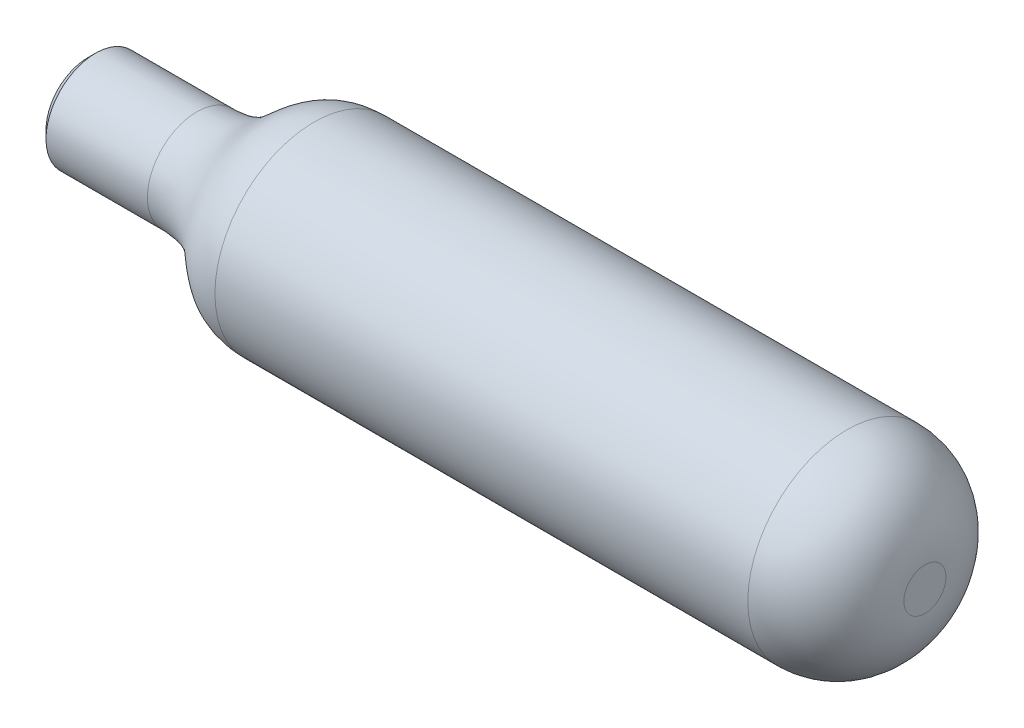
ISO-10303-21;
HEADER;
FILE_DESCRIPTION(('STEP AP214'),'2;1');
FILE_NAME('part.step','',(''),(''),'','','');
FILE_SCHEMA(('AUTOMOTIVE_DESIGN { 1 0 10303 214 1 1 1 1 }'));
ENDSEC;
DATA;
#1=APPLICATION_CONTEXT('core data for automotive mechanical design processes');
#2=APPLICATION_PROTOCOL_DEFINITION('international standard','automotive_design',2000,#1);
#3=PRODUCT_CONTEXT('',#1,'mechanical');
#4=PRODUCT('Part','Part','',(#3));
#5=PRODUCT_RELATED_PRODUCT_CATEGORY('part','',(#4));
#6=PRODUCT_DEFINITION_FORMATION('','',#4);
#7=PRODUCT_DEFINITION_CONTEXT('part definition',#1,'design');
#8=PRODUCT_DEFINITION('design','',#6,#7);
#9=PRODUCT_DEFINITION_SHAPE('','',#8);
#10=(LENGTH_UNIT() NAMED_UNIT(*) SI_UNIT(.MILLI.,.METRE.));
#11=(NAMED_UNIT(*) PLANE_ANGLE_UNIT() SI_UNIT($,.RADIAN.));
#12=(NAMED_UNIT(*) SI_UNIT($,.STERADIAN.) SOLID_ANGLE_UNIT());
#13=UNCERTAINTY_MEASURE_WITH_UNIT(LENGTH_MEASURE(1.E-05),#10,'distance_accuracy_value','');
#14=(GEOMETRIC_REPRESENTATION_CONTEXT(3) GLOBAL_UNCERTAINTY_ASSIGNED_CONTEXT((#13)) GLOBAL_UNIT_ASSIGNED_CONTEXT((#10,
#11,#12)) REPRESENTATION_CONTEXT('',''));
#15=CARTESIAN_POINT('',(0.,0.,0.));
#16=DIRECTION('',(0.,0.,1.));
#17=DIRECTION('',(1.,0.,0.));
#18=AXIS2_PLACEMENT_3D('',#15,#16,#17);
#19=CARTESIAN_POINT('',(-39.0343170620043,15.1693717385606,0.));
#20=CARTESIAN_POINT('',(-46.4250760569513,15.0317159675406,0.));
#21=CARTESIAN_POINT('',(-45.6399179348414,8.71614945488328,0.));
#22=CARTESIAN_POINT('',(-54.0343170620043,8.81937173856061,0.));
#23=B_SPLINE_CURVE_WITH_KNOTS('',3,(#19,#20,#21,#22),.UNSPECIFIED.,.F.,.F.,(4,4),(0.,1.),.UNSPECIFIED.);
#24=CARTESIAN_POINT('',(-68.0343170620043,2.46937173856061,0.));
#25=DIRECTION('',(-1.,0.,0.));
#26=AXIS1_PLACEMENT('',#24,#25);
#27=SURFACE_OF_REVOLUTION('',#23,#26);
#28=CARTESIAN_POINT('',(-54.0343170620043,2.46937173856061,0.));
#29=DIRECTION('',(-1.,0.,0.));
#30=DIRECTION('',(0.,0.,1.));
#31=AXIS2_PLACEMENT_3D('',#28,#29,#30);
#32=CIRCLE('',#31,6.35);
#33=CARTESIAN_POINT('',(-54.0343170620043,2.46937173856061,6.35));
#34=VERTEX_POINT('',#33);
#35=EDGE_CURVE('E65',#34,#34,#32,.T.);
#36=ORIENTED_EDGE('',*,*,#35,.F.);
#37=EDGE_LOOP('',(#36));
#38=FACE_BOUND('',#37,.T.);
#39=CARTESIAN_POINT('',(-39.0343170620043,2.46937173856061,0.));
#40=DIRECTION('',(-1.,0.,0.));
#41=DIRECTION('',(0.,0.,1.));
#42=AXIS2_PLACEMENT_3D('',#39,#40,#41);
#43=CIRCLE('',#42,12.7);
#44=CARTESIAN_POINT('',(-39.0343170620043,2.46937173856061,12.7));
#45=VERTEX_POINT('',#44);
#46=EDGE_CURVE('E10',#45,#45,#43,.T.);
#47=ORIENTED_EDGE('',*,*,#46,.T.);
#48=EDGE_LOOP('',(#47));
#49=FACE_BOUND('',#48,.T.);
#50=ADVANCED_FACE('F36',(#38,#49),#27,.T.);
#51=CARTESIAN_POINT('',(-68.0343170620043,2.46937173856061,0.));
#52=DIRECTION('',(-1.,0.,0.));
#53=DIRECTION('',(0.,0.,1.));
#54=AXIS2_PLACEMENT_3D('',#51,#52,#53);
#55=CYLINDRICAL_SURFACE('',#54,12.7);
#56=ORIENTED_EDGE('',*,*,#46,.F.);
#57=EDGE_LOOP('',(#56));
#58=FACE_BOUND('',#57,.T.);
#59=CARTESIAN_POINT('',(29.2656829379957,2.46937173856061,0.));
#60=DIRECTION('',(-1.,0.,0.));
#61=DIRECTION('',(0.,0.,1.));
#62=AXIS2_PLACEMENT_3D('',#59,#60,#61);
#63=CIRCLE('',#62,12.7);
#64=CARTESIAN_POINT('',(29.2656829379957,2.46937173856061,12.7));
#65=VERTEX_POINT('',#64);
#66=EDGE_CURVE('E44',#65,#65,#63,.T.);
#67=ORIENTED_EDGE('',*,*,#66,.T.);
#68=EDGE_LOOP('',(#67));
#69=FACE_BOUND('',#68,.T.);
#70=ADVANCED_FACE('F78',(#58,#69),#55,.T.);
#71=CARTESIAN_POINT('',(29.2656829379957,2.46937173856061,0.));
#72=DIRECTION('',(-1.,0.,0.));
#73=DIRECTION('',(0.,0.,1.));
#74=AXIS2_PLACEMENT_3D('',#71,#72,#73);
#75=DEGENERATE_TOROIDAL_SURFACE('',#74,2.7,10.,.T.);
#76=ORIENTED_EDGE('',*,*,#66,.F.);
#77=EDGE_LOOP('',(#76));
#78=FACE_BOUND('',#77,.T.);
#79=CARTESIAN_POINT('',(39.2656829379957,2.46937173856061,0.));
#80=DIRECTION('',(-1.,0.,0.));
#81=DIRECTION('',(0.,0.,1.));
#82=AXIS2_PLACEMENT_3D('',#79,#80,#81);
#83=CIRCLE('',#82,2.7);
#84=CARTESIAN_POINT('',(39.2656829379957,2.46937173856061,2.7));
#85=VERTEX_POINT('',#84);
#86=EDGE_CURVE('E50',#85,#85,#83,.T.);
#87=ORIENTED_EDGE('',*,*,#86,.T.);
#88=EDGE_LOOP('',(#87));
#89=FACE_BOUND('',#88,.T.);
#90=ADVANCED_FACE('F82',(#78,#89),#75,.T.);
#91=CARTESIAN_POINT('',(39.2656829379957,5.16937173856061,0.));
#92=DIRECTION('',(-1.,0.,0.));
#93=DIRECTION('',(0.,0.,1.));
#94=AXIS2_PLACEMENT_3D('',#91,#92,#93);
#95=PLANE('',#94);
#96=ORIENTED_EDGE('',*,*,#86,.F.);
#97=EDGE_LOOP('',(#96));
#98=FACE_BOUND('',#97,.T.);
#99=ADVANCED_FACE('F87',(#98),#95,.F.);
#100=CARTESIAN_POINT('',(-68.0343170620043,2.46937173856061,0.));
#101=DIRECTION('',(1.,0.,0.));
#102=DIRECTION('',(0.,0.,-1.));
#103=AXIS2_PLACEMENT_3D('',#100,#101,#102);
#104=PLANE('',#103);
#105=CARTESIAN_POINT('',(-68.0343170620043,2.46937173856061,0.));
#106=DIRECTION('',(-1.,0.,0.));
#107=DIRECTION('',(0.,0.,1.));
#108=AXIS2_PLACEMENT_3D('',#105,#106,#107);
#109=CIRCLE('',#108,5.35);
#110=CARTESIAN_POINT('',(-68.0343170620043,2.46937173856061,5.35));
#111=VERTEX_POINT('',#110);
#112=EDGE_CURVE('E55',#111,#111,#109,.T.);
#113=ORIENTED_EDGE('',*,*,#112,.T.);
#114=EDGE_LOOP('',(#113));
#115=FACE_BOUND('',#114,.T.);
#116=ADVANCED_FACE('F93',(#115),#104,.F.);
#117=CARTESIAN_POINT('',(-67.0343170620043,2.46937173856061,0.));
#118=DIRECTION('',(1.,0.,0.));
#119=DIRECTION('',(0.,0.,-1.));
#120=AXIS2_PLACEMENT_3D('',#117,#118,#119);
#121=CONICAL_SURFACE('',#120,6.35,0.785398163397447);
#122=ORIENTED_EDGE('',*,*,#112,.F.);
#123=EDGE_LOOP('',(#122));
#124=FACE_BOUND('',#123,.T.);
#125=CARTESIAN_POINT('',(-67.0343170620043,2.46937173856061,0.));
#126=DIRECTION('',(-1.,0.,0.));
#127=DIRECTION('',(0.,0.,1.));
#128=AXIS2_PLACEMENT_3D('',#125,#126,#127);
#129=CIRCLE('',#128,6.35);
#130=CARTESIAN_POINT('',(-67.0343170620043,2.46937173856061,6.35));
#131=VERTEX_POINT('',#130);
#132=EDGE_CURVE('E61',#131,#131,#129,.T.);
#133=ORIENTED_EDGE('',*,*,#132,.T.);
#134=EDGE_LOOP('',(#133));
#135=FACE_BOUND('',#134,.T.);
#136=ADVANCED_FACE('F97',(#124,#135),#121,.T.);
#137=CARTESIAN_POINT('',(-68.0343170620043,2.46937173856061,0.));
#138=DIRECTION('',(-1.,0.,0.));
#139=DIRECTION('',(0.,0.,1.));
#140=AXIS2_PLACEMENT_3D('',#137,#138,#139);
#141=CYLINDRICAL_SURFACE('',#140,6.35);
#142=ORIENTED_EDGE('',*,*,#132,.F.);
#143=EDGE_LOOP('',(#142));
#144=FACE_BOUND('',#143,.T.);
#145=ORIENTED_EDGE('',*,*,#35,.T.);
#146=EDGE_LOOP('',(#145));
#147=FACE_BOUND('',#146,.T.);
#148=ADVANCED_FACE('F75',(#144,#147),#141,.T.);
#149=CLOSED_SHELL('',(#50,#70,#90,#99,#116,#136,#148));
#150=MANIFOLD_SOLID_BREP('B2',#149);
#151=ADVANCED_BREP_SHAPE_REPRESENTATION('',(#18,#150),#14);
#152=SHAPE_DEFINITION_REPRESENTATION(#9,#151);
ENDSEC;
END-ISO-10303-21;
